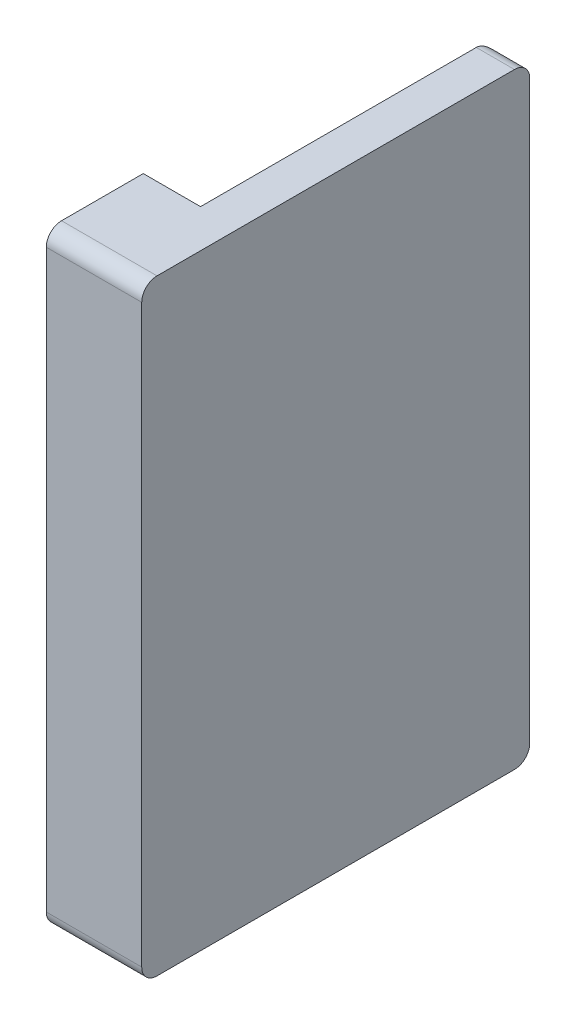
ISO-10303-21;
HEADER;
FILE_DESCRIPTION(('STEP AP214'),'2;1');
FILE_NAME('part.step','',(''),(''),'','','');
FILE_SCHEMA(('AUTOMOTIVE_DESIGN { 1 0 10303 214 1 1 1 1 }'));
ENDSEC;
DATA;
#1=APPLICATION_CONTEXT('core data for automotive mechanical design processes');
#2=APPLICATION_PROTOCOL_DEFINITION('international standard','automotive_design',2000,#1);
#3=PRODUCT_CONTEXT('',#1,'mechanical');
#4=PRODUCT('Part','Part','',(#3));
#5=PRODUCT_RELATED_PRODUCT_CATEGORY('part','',(#4));
#6=PRODUCT_DEFINITION_FORMATION('','',#4);
#7=PRODUCT_DEFINITION_CONTEXT('part definition',#1,'design');
#8=PRODUCT_DEFINITION('design','',#6,#7);
#9=PRODUCT_DEFINITION_SHAPE('','',#8);
#10=(LENGTH_UNIT() NAMED_UNIT(*) SI_UNIT(.MILLI.,.METRE.));
#11=(NAMED_UNIT(*) PLANE_ANGLE_UNIT() SI_UNIT($,.RADIAN.));
#12=(NAMED_UNIT(*) SI_UNIT($,.STERADIAN.) SOLID_ANGLE_UNIT());
#13=UNCERTAINTY_MEASURE_WITH_UNIT(LENGTH_MEASURE(1.E-05),#10,'distance_accuracy_value','');
#14=(GEOMETRIC_REPRESENTATION_CONTEXT(3) GLOBAL_UNCERTAINTY_ASSIGNED_CONTEXT((#13)) GLOBAL_UNIT_ASSIGNED_CONTEXT((#10,
#11,#12)) REPRESENTATION_CONTEXT('',''));
#15=CARTESIAN_POINT('',(0.,0.,0.));
#16=DIRECTION('',(0.,0.,1.));
#17=DIRECTION('',(1.,0.,0.));
#18=AXIS2_PLACEMENT_3D('',#15,#16,#17);
#19=CARTESIAN_POINT('',(0.,79.375,0.));
#20=DIRECTION('',(0.,0.,-1.));
#21=DIRECTION('',(-1.,0.,0.));
#22=AXIS2_PLACEMENT_3D('',#19,#20,#21);
#23=PLANE('',#22);
#24=DIRECTION('',(0.,-1.,0.));
#25=VECTOR('',#24,1.);
#26=CARTESIAN_POINT('',(0.,79.375,0.));
#27=LINE('',#26,#25);
#28=CARTESIAN_POINT('',(0.,77.375,0.));
#29=VERTEX_POINT('',#28);
#30=CARTESIAN_POINT('',(0.,2.00000000000003,0.));
#31=VERTEX_POINT('',#30);
#32=EDGE_CURVE('E143',#29,#31,#27,.T.);
#33=ORIENTED_EDGE('',*,*,#32,.T.);
#34=DIRECTION('',(1.,0.,0.));
#35=VECTOR('',#34,1.);
#36=CARTESIAN_POINT('',(0.,2.,0.));
#37=LINE('',#36,#35);
#38=CARTESIAN_POINT('',(12.5,2.00000000000003,0.));
#39=VERTEX_POINT('',#38);
#40=EDGE_CURVE('E164',#31,#39,#37,.T.);
#41=ORIENTED_EDGE('',*,*,#40,.T.);
#42=DIRECTION('',(0.,-1.,0.));
#43=VECTOR('',#42,1.);
#44=CARTESIAN_POINT('',(12.5,79.375,0.));
#45=LINE('',#44,#43);
#46=CARTESIAN_POINT('',(12.5,77.375,0.));
#47=VERTEX_POINT('',#46);
#48=EDGE_CURVE('E159',#47,#39,#45,.T.);
#49=ORIENTED_EDGE('',*,*,#48,.F.);
#50=DIRECTION('',(1.,0.,0.));
#51=VECTOR('',#50,1.);
#52=CARTESIAN_POINT('',(0.,77.375,0.));
#53=LINE('',#52,#51);
#54=EDGE_CURVE('E162',#47,#29,#53,.F.);
#55=ORIENTED_EDGE('',*,*,#54,.T.);
#56=EDGE_LOOP('',(#33,#41,#49,#55));
#57=FACE_BOUND('',#56,.T.);
#58=ADVANCED_FACE('F35',(#57),#23,.F.);
#59=CARTESIAN_POINT('',(12.5,79.375,0.));
#60=DIRECTION('',(-1.,0.,0.));
#61=DIRECTION('',(0.,0.,1.));
#62=AXIS2_PLACEMENT_3D('',#59,#60,#61);
#63=PLANE('',#62);
#64=ORIENTED_EDGE('',*,*,#48,.T.);
#65=CARTESIAN_POINT('',(12.5,2.,-2.));
#66=DIRECTION('',(-1.,0.,0.));
#67=DIRECTION('',(0.,0.,1.));
#68=AXIS2_PLACEMENT_3D('',#65,#66,#67);
#69=CIRCLE('',#68,2.);
#70=CARTESIAN_POINT('',(12.5,0.,-2.));
#71=VERTEX_POINT('',#70);
#72=EDGE_CURVE('E173',#39,#71,#69,.F.);
#73=ORIENTED_EDGE('',*,*,#72,.T.);
#74=DIRECTION('',(0.,0.,-1.));
#75=VECTOR('',#74,1.);
#76=CARTESIAN_POINT('',(12.5,0.,0.));
#77=LINE('',#76,#75);
#78=CARTESIAN_POINT('',(12.5,0.,-48.8));
#79=VERTEX_POINT('',#78);
#80=EDGE_CURVE('E147',#71,#79,#77,.T.);
#81=ORIENTED_EDGE('',*,*,#80,.T.);
#82=CARTESIAN_POINT('',(12.5,2.,-48.8));
#83=DIRECTION('',(-1.,0.,0.));
#84=DIRECTION('',(0.,0.,1.));
#85=AXIS2_PLACEMENT_3D('',#82,#83,#84);
#86=CIRCLE('',#85,2.);
#87=CARTESIAN_POINT('',(12.5,2.00000000000003,-50.8));
#88=VERTEX_POINT('',#87);
#89=EDGE_CURVE('E167',#79,#88,#86,.F.);
#90=ORIENTED_EDGE('',*,*,#89,.T.);
#91=DIRECTION('',(0.,-1.,0.));
#92=VECTOR('',#91,1.);
#93=CARTESIAN_POINT('',(12.5,79.375,-50.8));
#94=LINE('',#93,#92);
#95=CARTESIAN_POINT('',(12.5,77.375,-50.8));
#96=VERTEX_POINT('',#95);
#97=EDGE_CURVE('E125',#96,#88,#94,.T.);
#98=ORIENTED_EDGE('',*,*,#97,.F.);
#99=CARTESIAN_POINT('',(12.5,77.375,-48.8));
#100=DIRECTION('',(-1.,0.,0.));
#101=DIRECTION('',(0.,0.,1.));
#102=AXIS2_PLACEMENT_3D('',#99,#100,#101);
#103=CIRCLE('',#102,2.);
#104=CARTESIAN_POINT('',(12.5,79.375,-48.8));
#105=VERTEX_POINT('',#104);
#106=EDGE_CURVE('E169',#96,#105,#103,.F.);
#107=ORIENTED_EDGE('',*,*,#106,.T.);
#108=DIRECTION('',(0.,0.,-1.));
#109=VECTOR('',#108,1.);
#110=CARTESIAN_POINT('',(12.5,79.375,0.));
#111=LINE('',#110,#109);
#112=CARTESIAN_POINT('',(12.5,79.375,-2.));
#113=VERTEX_POINT('',#112);
#114=EDGE_CURVE('E136',#113,#105,#111,.T.);
#115=ORIENTED_EDGE('',*,*,#114,.F.);
#116=CARTESIAN_POINT('',(12.5,77.375,-2.));
#117=DIRECTION('',(-1.,0.,0.));
#118=DIRECTION('',(0.,0.,1.));
#119=AXIS2_PLACEMENT_3D('',#116,#117,#118);
#120=CIRCLE('',#119,2.);
#121=EDGE_CURVE('E171',#113,#47,#120,.F.);
#122=ORIENTED_EDGE('',*,*,#121,.T.);
#123=EDGE_LOOP('',(#64,#73,#81,#90,#98,#107,#115,#122));
#124=FACE_BOUND('',#123,.T.);
#125=ADVANCED_FACE('F204',(#124),#63,.F.);
#126=CARTESIAN_POINT('',(0.,79.375,-50.8));
#127=DIRECTION('',(0.,0.,-1.));
#128=DIRECTION('',(-1.,0.,0.));
#129=AXIS2_PLACEMENT_3D('',#126,#127,#128);
#130=PLANE('',#129);
#131=DIRECTION('',(0.,-1.,0.));
#132=VECTOR('',#131,1.);
#133=CARTESIAN_POINT('',(9.5,79.375,-50.8));
#134=LINE('',#133,#132);
#135=CARTESIAN_POINT('',(9.5,2.,-50.8));
#136=VERTEX_POINT('',#135);
#137=CARTESIAN_POINT('',(9.5,77.375,-50.8));
#138=VERTEX_POINT('',#137);
#139=EDGE_CURVE('E52',#136,#138,#134,.F.);
#140=ORIENTED_EDGE('',*,*,#139,.T.);
#141=DIRECTION('',(1.,0.,0.));
#142=VECTOR('',#141,1.);
#143=CARTESIAN_POINT('',(0.,77.375,-50.8));
#144=LINE('',#143,#142);
#145=EDGE_CURVE('E44',#138,#96,#144,.T.);
#146=ORIENTED_EDGE('',*,*,#145,.T.);
#147=ORIENTED_EDGE('',*,*,#97,.T.);
#148=DIRECTION('',(1.,0.,0.));
#149=VECTOR('',#148,1.);
#150=CARTESIAN_POINT('',(7.5,2.,-50.8));
#151=LINE('',#150,#149);
#152=EDGE_CURVE('E57',#88,#136,#151,.F.);
#153=ORIENTED_EDGE('',*,*,#152,.T.);
#154=EDGE_LOOP('',(#140,#146,#147,#153));
#155=FACE_BOUND('',#154,.T.);
#156=ADVANCED_FACE('F223',(#155),#130,.T.);
#157=CARTESIAN_POINT('',(7.5,79.375,0.));
#158=DIRECTION('',(-1.,0.,0.));
#159=DIRECTION('',(0.,0.,1.));
#160=AXIS2_PLACEMENT_3D('',#157,#158,#159);
#161=PLANE('',#160);
#162=DIRECTION('',(0.,0.,-1.));
#163=VECTOR('',#162,1.);
#164=CARTESIAN_POINT('',(7.5,79.375,0.));
#165=LINE('',#164,#163);
#166=CARTESIAN_POINT('',(7.5,79.375,-12.7));
#167=VERTEX_POINT('',#166);
#168=CARTESIAN_POINT('',(7.5,79.375,-48.8));
#169=VERTEX_POINT('',#168);
#170=EDGE_CURVE('E117',#167,#169,#165,.T.);
#171=ORIENTED_EDGE('',*,*,#170,.T.);
#172=DIRECTION('',(0.,-1.,0.));
#173=VECTOR('',#172,1.);
#174=CARTESIAN_POINT('',(7.5,79.375,-48.8));
#175=LINE('',#174,#173);
#176=CARTESIAN_POINT('',(7.5,0.,-48.8));
#177=VERTEX_POINT('',#176);
#178=EDGE_CURVE('E11',#169,#177,#175,.T.);
#179=ORIENTED_EDGE('',*,*,#178,.T.);
#180=DIRECTION('',(0.,0.,-1.));
#181=VECTOR('',#180,1.);
#182=CARTESIAN_POINT('',(7.5,0.,0.));
#183=LINE('',#182,#181);
#184=CARTESIAN_POINT('',(7.5,0.,-12.7));
#185=VERTEX_POINT('',#184);
#186=EDGE_CURVE('E120',#185,#177,#183,.T.);
#187=ORIENTED_EDGE('',*,*,#186,.F.);
#188=DIRECTION('',(0.,-1.,0.));
#189=VECTOR('',#188,1.);
#190=CARTESIAN_POINT('',(7.5,79.375,-12.7));
#191=LINE('',#190,#189);
#192=EDGE_CURVE('E114',#167,#185,#191,.T.);
#193=ORIENTED_EDGE('',*,*,#192,.F.);
#194=EDGE_LOOP('',(#171,#179,#187,#193));
#195=FACE_BOUND('',#194,.T.);
#196=ADVANCED_FACE('F116',(#195),#161,.T.);
#197=CARTESIAN_POINT('',(0.,79.375,-12.7));
#198=DIRECTION('',(0.,0.,-1.));
#199=DIRECTION('',(-1.,0.,0.));
#200=AXIS2_PLACEMENT_3D('',#197,#198,#199);
#201=PLANE('',#200);
#202=DIRECTION('',(1.,0.,0.));
#203=VECTOR('',#202,1.);
#204=CARTESIAN_POINT('',(0.,0.,-12.7));
#205=LINE('',#204,#203);
#206=CARTESIAN_POINT('',(0.,0.,-12.7));
#207=VERTEX_POINT('',#206);
#208=EDGE_CURVE('E151',#207,#185,#205,.T.);
#209=ORIENTED_EDGE('',*,*,#208,.F.);
#210=DIRECTION('',(0.,-1.,0.));
#211=VECTOR('',#210,1.);
#212=CARTESIAN_POINT('',(0.,79.375,-12.7));
#213=LINE('',#212,#211);
#214=CARTESIAN_POINT('',(0.,79.375,-12.7));
#215=VERTEX_POINT('',#214);
#216=EDGE_CURVE('E126',#215,#207,#213,.T.);
#217=ORIENTED_EDGE('',*,*,#216,.F.);
#218=DIRECTION('',(1.,0.,0.));
#219=VECTOR('',#218,1.);
#220=CARTESIAN_POINT('',(0.,79.375,-12.7));
#221=LINE('',#220,#219);
#222=EDGE_CURVE('E132',#215,#167,#221,.T.);
#223=ORIENTED_EDGE('',*,*,#222,.T.);
#224=ORIENTED_EDGE('',*,*,#192,.T.);
#225=EDGE_LOOP('',(#209,#217,#223,#224));
#226=FACE_BOUND('',#225,.T.);
#227=ADVANCED_FACE('F139',(#226),#201,.T.);
#228=CARTESIAN_POINT('',(0.,79.375,0.));
#229=DIRECTION('',(-1.,0.,0.));
#230=DIRECTION('',(0.,0.,1.));
#231=AXIS2_PLACEMENT_3D('',#228,#229,#230);
#232=PLANE('',#231);
#233=DIRECTION('',(0.,0.,-1.));
#234=VECTOR('',#233,1.);
#235=CARTESIAN_POINT('',(0.,0.,0.));
#236=LINE('',#235,#234);
#237=CARTESIAN_POINT('',(0.,0.,-2.));
#238=VERTEX_POINT('',#237);
#239=EDGE_CURVE('E153',#238,#207,#236,.T.);
#240=ORIENTED_EDGE('',*,*,#239,.F.);
#241=CARTESIAN_POINT('',(0.,2.,-2.));
#242=DIRECTION('',(-1.,0.,0.));
#243=DIRECTION('',(0.,0.,1.));
#244=AXIS2_PLACEMENT_3D('',#241,#242,#243);
#245=CIRCLE('',#244,2.);
#246=EDGE_CURVE('E181',#238,#31,#245,.T.);
#247=ORIENTED_EDGE('',*,*,#246,.T.);
#248=ORIENTED_EDGE('',*,*,#32,.F.);
#249=CARTESIAN_POINT('',(0.,77.375,-2.));
#250=DIRECTION('',(-1.,0.,0.));
#251=DIRECTION('',(0.,0.,1.));
#252=AXIS2_PLACEMENT_3D('',#249,#250,#251);
#253=CIRCLE('',#252,2.);
#254=CARTESIAN_POINT('',(0.,79.375,-2.));
#255=VERTEX_POINT('',#254);
#256=EDGE_CURVE('E179',#29,#255,#253,.T.);
#257=ORIENTED_EDGE('',*,*,#256,.T.);
#258=DIRECTION('',(0.,0.,-1.));
#259=VECTOR('',#258,1.);
#260=CARTESIAN_POINT('',(0.,79.375,0.));
#261=LINE('',#260,#259);
#262=EDGE_CURVE('E141',#255,#215,#261,.T.);
#263=ORIENTED_EDGE('',*,*,#262,.T.);
#264=ORIENTED_EDGE('',*,*,#216,.T.);
#265=EDGE_LOOP('',(#240,#247,#248,#257,#263,#264));
#266=FACE_BOUND('',#265,.T.);
#267=ADVANCED_FACE('F217',(#266),#232,.T.);
#268=CARTESIAN_POINT('',(0.,79.375,0.));
#269=DIRECTION('',(0.,1.,0.));
#270=DIRECTION('',(0.,0.,1.));
#271=AXIS2_PLACEMENT_3D('',#268,#269,#270);
#272=PLANE('',#271);
#273=ORIENTED_EDGE('',*,*,#262,.F.);
#274=DIRECTION('',(1.,0.,0.));
#275=VECTOR('',#274,1.);
#276=CARTESIAN_POINT('',(12.5,79.375,-2.));
#277=LINE('',#276,#275);
#278=EDGE_CURVE('E184',#255,#113,#277,.T.);
#279=ORIENTED_EDGE('',*,*,#278,.T.);
#280=ORIENTED_EDGE('',*,*,#114,.T.);
#281=DIRECTION('',(1.,0.,0.));
#282=VECTOR('',#281,1.);
#283=CARTESIAN_POINT('',(0.,79.375,-48.8));
#284=LINE('',#283,#282);
#285=EDGE_CURVE('E135',#105,#169,#284,.F.);
#286=ORIENTED_EDGE('',*,*,#285,.T.);
#287=ORIENTED_EDGE('',*,*,#170,.F.);
#288=ORIENTED_EDGE('',*,*,#222,.F.);
#289=EDGE_LOOP('',(#273,#279,#280,#286,#287,#288));
#290=FACE_BOUND('',#289,.T.);
#291=ADVANCED_FACE('F131',(#290),#272,.T.);
#292=CARTESIAN_POINT('',(0.,0.,0.));
#293=DIRECTION('',(0.,1.,0.));
#294=DIRECTION('',(0.,0.,1.));
#295=AXIS2_PLACEMENT_3D('',#292,#293,#294);
#296=PLANE('',#295);
#297=ORIENTED_EDGE('',*,*,#80,.F.);
#298=DIRECTION('',(1.,0.,0.));
#299=VECTOR('',#298,1.);
#300=CARTESIAN_POINT('',(0.,0.,-2.));
#301=LINE('',#300,#299);
#302=EDGE_CURVE('E177',#71,#238,#301,.F.);
#303=ORIENTED_EDGE('',*,*,#302,.T.);
#304=ORIENTED_EDGE('',*,*,#239,.T.);
#305=ORIENTED_EDGE('',*,*,#208,.T.);
#306=ORIENTED_EDGE('',*,*,#186,.T.);
#307=DIRECTION('',(1.,0.,0.));
#308=VECTOR('',#307,1.);
#309=CARTESIAN_POINT('',(12.5,0.,-48.8));
#310=LINE('',#309,#308);
#311=EDGE_CURVE('E175',#177,#79,#310,.T.);
#312=ORIENTED_EDGE('',*,*,#311,.T.);
#313=EDGE_LOOP('',(#297,#303,#304,#305,#306,#312));
#314=FACE_BOUND('',#313,.T.);
#315=ADVANCED_FACE('F201',(#314),#296,.F.);
#316=CARTESIAN_POINT('',(0.,2.,-2.));
#317=DIRECTION('',(1.,0.,0.));
#318=DIRECTION('',(0.,0.,-1.));
#319=AXIS2_PLACEMENT_3D('',#316,#317,#318);
#320=CYLINDRICAL_SURFACE('',#319,2.);
#321=ORIENTED_EDGE('',*,*,#246,.F.);
#322=ORIENTED_EDGE('',*,*,#302,.F.);
#323=ORIENTED_EDGE('',*,*,#72,.F.);
#324=ORIENTED_EDGE('',*,*,#40,.F.);
#325=EDGE_LOOP('',(#321,#322,#323,#324));
#326=FACE_BOUND('',#325,.T.);
#327=ADVANCED_FACE('F210',(#326),#320,.T.);
#328=CARTESIAN_POINT('',(0.,77.375,-2.));
#329=DIRECTION('',(-1.,0.,0.));
#330=DIRECTION('',(0.,0.,1.));
#331=AXIS2_PLACEMENT_3D('',#328,#329,#330);
#332=CYLINDRICAL_SURFACE('',#331,2.);
#333=ORIENTED_EDGE('',*,*,#256,.F.);
#334=ORIENTED_EDGE('',*,*,#54,.F.);
#335=ORIENTED_EDGE('',*,*,#121,.F.);
#336=ORIENTED_EDGE('',*,*,#278,.F.);
#337=EDGE_LOOP('',(#333,#334,#335,#336));
#338=FACE_BOUND('',#337,.T.);
#339=ADVANCED_FACE('F220',(#338),#332,.T.);
#340=CARTESIAN_POINT('',(0.,2.,-48.8));
#341=DIRECTION('',(-1.,0.,0.));
#342=DIRECTION('',(0.,0.,1.));
#343=AXIS2_PLACEMENT_3D('',#340,#341,#342);
#344=CYLINDRICAL_SURFACE('',#343,2.);
#345=ORIENTED_EDGE('',*,*,#89,.F.);
#346=ORIENTED_EDGE('',*,*,#311,.F.);
#347=CARTESIAN_POINT('',(9.5,2.,-48.8));
#348=DIRECTION('',(0.707106781186547,-0.707106781186547,0.));
#349=DIRECTION('',(-0.707106781186547,-0.707106781186547,0.));
#350=AXIS2_PLACEMENT_3D('',#347,#348,#349);
#351=ELLIPSE('',#350,2.82842712474619,2.);
#352=EDGE_CURVE('E39',#136,#177,#351,.F.);
#353=ORIENTED_EDGE('',*,*,#352,.F.);
#354=ORIENTED_EDGE('',*,*,#152,.F.);
#355=EDGE_LOOP('',(#345,#346,#353,#354));
#356=FACE_BOUND('',#355,.T.);
#357=ADVANCED_FACE('F37',(#356),#344,.T.);
#358=CARTESIAN_POINT('',(9.5,79.375,-48.8));
#359=DIRECTION('',(0.,-1.,0.));
#360=DIRECTION('',(0.,0.,-1.));
#361=AXIS2_PLACEMENT_3D('',#358,#359,#360);
#362=CYLINDRICAL_SURFACE('',#361,2.);
#363=ORIENTED_EDGE('',*,*,#352,.T.);
#364=ORIENTED_EDGE('',*,*,#178,.F.);
#365=CARTESIAN_POINT('',(9.5,77.375,-48.8));
#366=DIRECTION('',(-0.707106781186547,-0.707106781186547,0.));
#367=DIRECTION('',(0.707106781186547,-0.707106781186547,0.));
#368=AXIS2_PLACEMENT_3D('',#365,#366,#367);
#369=ELLIPSE('',#368,2.82842712474619,2.);
#370=EDGE_CURVE('E189',#138,#169,#369,.F.);
#371=ORIENTED_EDGE('',*,*,#370,.F.);
#372=ORIENTED_EDGE('',*,*,#139,.F.);
#373=EDGE_LOOP('',(#363,#364,#371,#372));
#374=FACE_BOUND('',#373,.T.);
#375=ADVANCED_FACE('F195',(#374),#362,.T.);
#376=CARTESIAN_POINT('',(0.,77.375,-48.8));
#377=DIRECTION('',(1.,0.,0.));
#378=DIRECTION('',(0.,0.,-1.));
#379=AXIS2_PLACEMENT_3D('',#376,#377,#378);
#380=CYLINDRICAL_SURFACE('',#379,2.);
#381=ORIENTED_EDGE('',*,*,#370,.T.);
#382=ORIENTED_EDGE('',*,*,#285,.F.);
#383=ORIENTED_EDGE('',*,*,#106,.F.);
#384=ORIENTED_EDGE('',*,*,#145,.F.);
#385=EDGE_LOOP('',(#381,#382,#383,#384));
#386=FACE_BOUND('',#385,.T.);
#387=ADVANCED_FACE('F222',(#386),#380,.T.);
#388=CLOSED_SHELL('',(#58,#125,#156,#196,#227,#267,#291,#315,#327,#339,#357,#375,#387));
#389=MANIFOLD_SOLID_BREP('B2',#388);
#390=ADVANCED_BREP_SHAPE_REPRESENTATION('',(#18,#389),#14);
#391=SHAPE_DEFINITION_REPRESENTATION(#9,#390);
ENDSEC;
END-ISO-10303-21;
